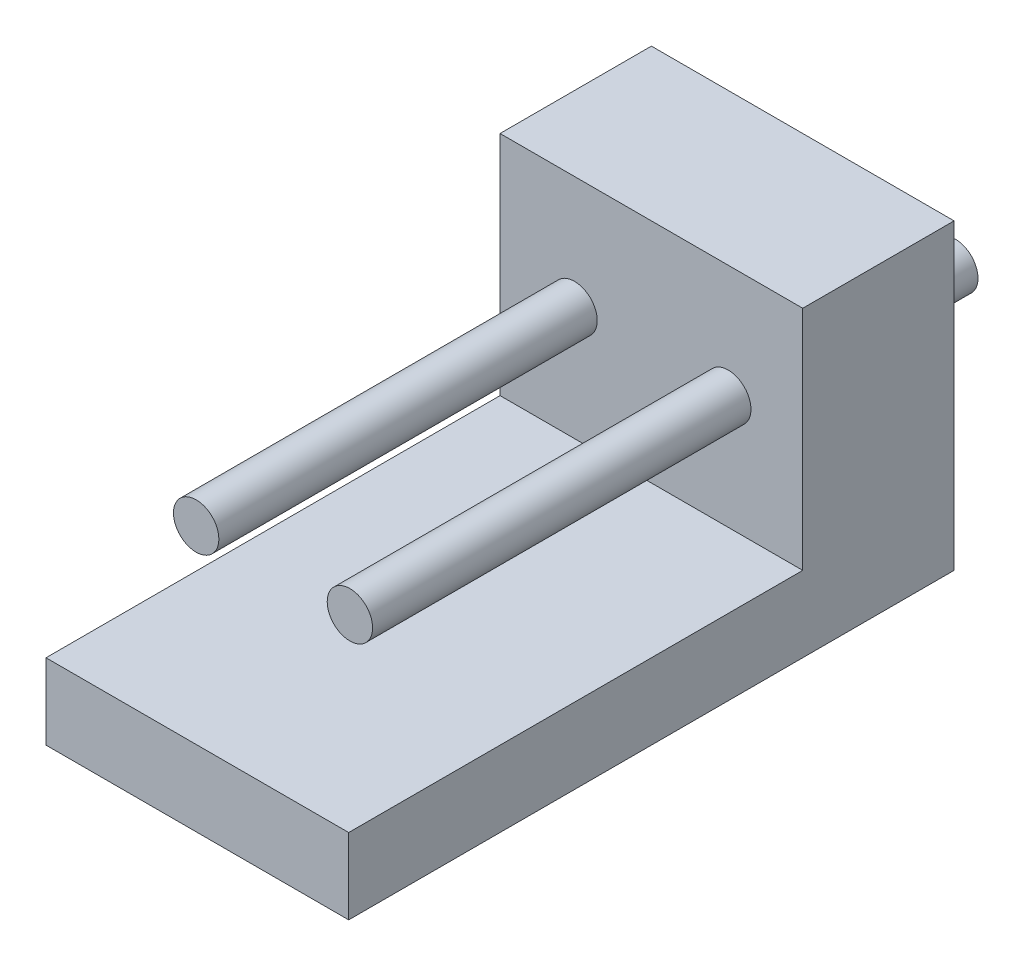
ISO-10303-21;
HEADER;
FILE_DESCRIPTION(('STEP AP214'),'2;1');
FILE_NAME('part.step','',(''),(''),'','','');
FILE_SCHEMA(('AUTOMOTIVE_DESIGN { 1 0 10303 214 1 1 1 1 }'));
ENDSEC;
DATA;
#1=APPLICATION_CONTEXT('core data for automotive mechanical design processes');
#2=APPLICATION_PROTOCOL_DEFINITION('international standard','automotive_design',2000,#1);
#3=PRODUCT_CONTEXT('',#1,'mechanical');
#4=PRODUCT('Part','Part','',(#3));
#5=PRODUCT_RELATED_PRODUCT_CATEGORY('part','',(#4));
#6=PRODUCT_DEFINITION_FORMATION('','',#4);
#7=PRODUCT_DEFINITION_CONTEXT('part definition',#1,'design');
#8=PRODUCT_DEFINITION('design','',#6,#7);
#9=PRODUCT_DEFINITION_SHAPE('','',#8);
#10=(LENGTH_UNIT() NAMED_UNIT(*) SI_UNIT(.MILLI.,.METRE.));
#11=(NAMED_UNIT(*) PLANE_ANGLE_UNIT() SI_UNIT($,.RADIAN.));
#12=(NAMED_UNIT(*) SI_UNIT($,.STERADIAN.) SOLID_ANGLE_UNIT());
#13=UNCERTAINTY_MEASURE_WITH_UNIT(LENGTH_MEASURE(1.E-05),#10,'distance_accuracy_value','');
#14=(GEOMETRIC_REPRESENTATION_CONTEXT(3) GLOBAL_UNCERTAINTY_ASSIGNED_CONTEXT((#13)) GLOBAL_UNIT_ASSIGNED_CONTEXT((#10,
#11,#12)) REPRESENTATION_CONTEXT('',''));
#15=CARTESIAN_POINT('',(0.,0.,0.));
#16=DIRECTION('',(0.,0.,1.));
#17=DIRECTION('',(1.,0.,0.));
#18=AXIS2_PLACEMENT_3D('',#15,#16,#17);
#19=CARTESIAN_POINT('',(0.,10.,5.));
#20=DIRECTION('',(0.,0.,-1.));
#21=DIRECTION('',(-1.,0.,0.));
#22=AXIS2_PLACEMENT_3D('',#19,#20,#21);
#23=PLANE('',#22);
#24=CARTESIAN_POINT('',(7.54,6.25,5.));
#25=DIRECTION('',(0.,0.,-1.));
#26=DIRECTION('',(-1.,0.,0.));
#27=AXIS2_PLACEMENT_3D('',#24,#25,#26);
#28=CIRCLE('',#27,0.750000000000001);
#29=CARTESIAN_POINT('',(6.79,6.25,5.));
#30=VERTEX_POINT('',#29);
#31=EDGE_CURVE('E38',#30,#30,#28,.F.);
#32=ORIENTED_EDGE('',*,*,#31,.F.);
#33=EDGE_LOOP('',(#32));
#34=FACE_BOUND('',#33,.T.);
#35=DIRECTION('',(-1.,0.,0.));
#36=VECTOR('',#35,1.);
#37=CARTESIAN_POINT('',(0.,2.5,5.));
#38=LINE('',#37,#36);
#39=CARTESIAN_POINT('',(10.,2.5,5.));
#40=VERTEX_POINT('',#39);
#41=CARTESIAN_POINT('',(0.,2.5,5.));
#42=VERTEX_POINT('',#41);
#43=EDGE_CURVE('E46',#40,#42,#38,.T.);
#44=ORIENTED_EDGE('',*,*,#43,.F.);
#45=DIRECTION('',(0.,1.,0.));
#46=VECTOR('',#45,1.);
#47=CARTESIAN_POINT('',(10.,0.,5.));
#48=LINE('',#47,#46);
#49=CARTESIAN_POINT('',(10.,10.,5.));
#50=VERTEX_POINT('',#49);
#51=EDGE_CURVE('E86',#40,#50,#48,.T.);
#52=ORIENTED_EDGE('',*,*,#51,.T.);
#53=DIRECTION('',(-1.,0.,0.));
#54=VECTOR('',#53,1.);
#55=CARTESIAN_POINT('',(0.,10.,5.));
#56=LINE('',#55,#54);
#57=CARTESIAN_POINT('',(0.,10.,5.));
#58=VERTEX_POINT('',#57);
#59=EDGE_CURVE('E51',#50,#58,#56,.T.);
#60=ORIENTED_EDGE('',*,*,#59,.T.);
#61=DIRECTION('',(0.,-1.,0.));
#62=VECTOR('',#61,1.);
#63=CARTESIAN_POINT('',(0.,0.,5.));
#64=LINE('',#63,#62);
#65=EDGE_CURVE('E81',#58,#42,#64,.T.);
#66=ORIENTED_EDGE('',*,*,#65,.T.);
#67=EDGE_LOOP('',(#44,#52,#60,#66));
#68=FACE_BOUND('',#67,.T.);
#69=CARTESIAN_POINT('',(2.46,6.25,5.));
#70=DIRECTION('',(0.,0.,-1.));
#71=DIRECTION('',(-1.,0.,0.));
#72=AXIS2_PLACEMENT_3D('',#69,#70,#71);
#73=CIRCLE('',#72,0.750000000000001);
#74=CARTESIAN_POINT('',(1.71,6.25,5.));
#75=VERTEX_POINT('',#74);
#76=EDGE_CURVE('E11',#75,#75,#73,.F.);
#77=ORIENTED_EDGE('',*,*,#76,.F.);
#78=EDGE_LOOP('',(#77));
#79=FACE_BOUND('',#78,.T.);
#80=ADVANCED_FACE('F29',(#34,#68,#79),#23,.F.);
#81=CARTESIAN_POINT('',(0.,10.,0.));
#82=DIRECTION('',(0.,0.,-1.));
#83=DIRECTION('',(-1.,0.,0.));
#84=AXIS2_PLACEMENT_3D('',#81,#82,#83);
#85=PLANE('',#84);
#86=CARTESIAN_POINT('',(7.54,6.25,0.));
#87=DIRECTION('',(0.,0.,-1.));
#88=DIRECTION('',(-1.,0.,0.));
#89=AXIS2_PLACEMENT_3D('',#86,#87,#88);
#90=CIRCLE('',#89,0.750000000000001);
#91=CARTESIAN_POINT('',(6.79,6.25,0.));
#92=VERTEX_POINT('',#91);
#93=EDGE_CURVE('E99',#92,#92,#90,.F.);
#94=ORIENTED_EDGE('',*,*,#93,.T.);
#95=EDGE_LOOP('',(#94));
#96=FACE_BOUND('',#95,.T.);
#97=DIRECTION('',(0.,-1.,0.));
#98=VECTOR('',#97,1.);
#99=CARTESIAN_POINT('',(0.,0.,0.));
#100=LINE('',#99,#98);
#101=CARTESIAN_POINT('',(0.,10.,0.));
#102=VERTEX_POINT('',#101);
#103=CARTESIAN_POINT('',(0.,0.,0.));
#104=VERTEX_POINT('',#103);
#105=EDGE_CURVE('E105',#102,#104,#100,.T.);
#106=ORIENTED_EDGE('',*,*,#105,.F.);
#107=DIRECTION('',(-1.,0.,0.));
#108=VECTOR('',#107,1.);
#109=CARTESIAN_POINT('',(0.,10.,0.));
#110=LINE('',#109,#108);
#111=CARTESIAN_POINT('',(10.,10.,0.));
#112=VERTEX_POINT('',#111);
#113=EDGE_CURVE('E87',#112,#102,#110,.T.);
#114=ORIENTED_EDGE('',*,*,#113,.F.);
#115=DIRECTION('',(0.,1.,0.));
#116=VECTOR('',#115,1.);
#117=CARTESIAN_POINT('',(10.,0.,0.));
#118=LINE('',#117,#116);
#119=CARTESIAN_POINT('',(10.,0.,0.));
#120=VERTEX_POINT('',#119);
#121=EDGE_CURVE('E139',#120,#112,#118,.T.);
#122=ORIENTED_EDGE('',*,*,#121,.F.);
#123=DIRECTION('',(1.,0.,0.));
#124=VECTOR('',#123,1.);
#125=CARTESIAN_POINT('',(0.,0.,0.));
#126=LINE('',#125,#124);
#127=EDGE_CURVE('E137',#104,#120,#126,.T.);
#128=ORIENTED_EDGE('',*,*,#127,.F.);
#129=EDGE_LOOP('',(#106,#114,#122,#128));
#130=FACE_BOUND('',#129,.T.);
#131=CARTESIAN_POINT('',(2.46,6.25,0.));
#132=DIRECTION('',(0.,0.,-1.));
#133=DIRECTION('',(-1.,0.,0.));
#134=AXIS2_PLACEMENT_3D('',#131,#132,#133);
#135=CIRCLE('',#134,0.750000000000001);
#136=CARTESIAN_POINT('',(1.71,6.25,0.));
#137=VERTEX_POINT('',#136);
#138=EDGE_CURVE('E33',#137,#137,#135,.F.);
#139=ORIENTED_EDGE('',*,*,#138,.T.);
#140=EDGE_LOOP('',(#139));
#141=FACE_BOUND('',#140,.T.);
#142=ADVANCED_FACE('F166',(#96,#130,#141),#85,.T.);
#143=CARTESIAN_POINT('',(0.,0.,5.));
#144=DIRECTION('',(1.,0.,0.));
#145=DIRECTION('',(0.,0.,-1.));
#146=AXIS2_PLACEMENT_3D('',#143,#144,#145);
#147=PLANE('',#146);
#148=ORIENTED_EDGE('',*,*,#105,.T.);
#149=DIRECTION('',(0.,0.,-1.));
#150=VECTOR('',#149,1.);
#151=CARTESIAN_POINT('',(0.,0.,5.));
#152=LINE('',#151,#150);
#153=CARTESIAN_POINT('',(0.,0.,20.));
#154=VERTEX_POINT('',#153);
#155=EDGE_CURVE('E128',#154,#104,#152,.T.);
#156=ORIENTED_EDGE('',*,*,#155,.F.);
#157=DIRECTION('',(0.,-1.,0.));
#158=VECTOR('',#157,1.);
#159=CARTESIAN_POINT('',(0.,0.,20.));
#160=LINE('',#159,#158);
#161=CARTESIAN_POINT('',(0.,2.5,20.));
#162=VERTEX_POINT('',#161);
#163=EDGE_CURVE('E98',#162,#154,#160,.T.);
#164=ORIENTED_EDGE('',*,*,#163,.F.);
#165=DIRECTION('',(0.,0.,-1.));
#166=VECTOR('',#165,1.);
#167=CARTESIAN_POINT('',(0.,2.5,20.));
#168=LINE('',#167,#166);
#169=EDGE_CURVE('E94',#162,#42,#168,.T.);
#170=ORIENTED_EDGE('',*,*,#169,.T.);
#171=ORIENTED_EDGE('',*,*,#65,.F.);
#172=DIRECTION('',(0.,0.,-1.));
#173=VECTOR('',#172,1.);
#174=CARTESIAN_POINT('',(0.,10.,5.));
#175=LINE('',#174,#173);
#176=EDGE_CURVE('E149',#58,#102,#175,.T.);
#177=ORIENTED_EDGE('',*,*,#176,.T.);
#178=EDGE_LOOP('',(#148,#156,#164,#170,#171,#177));
#179=FACE_BOUND('',#178,.T.);
#180=ADVANCED_FACE('F31',(#179),#147,.F.);
#181=CARTESIAN_POINT('',(0.,0.,5.));
#182=DIRECTION('',(0.,1.,0.));
#183=DIRECTION('',(0.,0.,1.));
#184=AXIS2_PLACEMENT_3D('',#181,#182,#183);
#185=PLANE('',#184);
#186=ORIENTED_EDGE('',*,*,#127,.T.);
#187=DIRECTION('',(0.,0.,-1.));
#188=VECTOR('',#187,1.);
#189=CARTESIAN_POINT('',(10.,0.,5.));
#190=LINE('',#189,#188);
#191=CARTESIAN_POINT('',(10.,0.,20.));
#192=VERTEX_POINT('',#191);
#193=EDGE_CURVE('E154',#192,#120,#190,.T.);
#194=ORIENTED_EDGE('',*,*,#193,.F.);
#195=DIRECTION('',(1.,0.,0.));
#196=VECTOR('',#195,1.);
#197=CARTESIAN_POINT('',(0.,0.,20.));
#198=LINE('',#197,#196);
#199=EDGE_CURVE('E132',#154,#192,#198,.T.);
#200=ORIENTED_EDGE('',*,*,#199,.F.);
#201=ORIENTED_EDGE('',*,*,#155,.T.);
#202=EDGE_LOOP('',(#186,#194,#200,#201));
#203=FACE_BOUND('',#202,.T.);
#204=ADVANCED_FACE('F162',(#203),#185,.F.);
#205=CARTESIAN_POINT('',(10.,0.,5.));
#206=DIRECTION('',(-1.,0.,0.));
#207=DIRECTION('',(0.,0.,1.));
#208=AXIS2_PLACEMENT_3D('',#205,#206,#207);
#209=PLANE('',#208);
#210=ORIENTED_EDGE('',*,*,#121,.T.);
#211=DIRECTION('',(0.,0.,-1.));
#212=VECTOR('',#211,1.);
#213=CARTESIAN_POINT('',(10.,10.,5.));
#214=LINE('',#213,#212);
#215=EDGE_CURVE('E150',#50,#112,#214,.T.);
#216=ORIENTED_EDGE('',*,*,#215,.F.);
#217=ORIENTED_EDGE('',*,*,#51,.F.);
#218=DIRECTION('',(0.,0.,-1.));
#219=VECTOR('',#218,1.);
#220=CARTESIAN_POINT('',(10.,2.5,20.));
#221=LINE('',#220,#219);
#222=CARTESIAN_POINT('',(10.,2.5,20.));
#223=VERTEX_POINT('',#222);
#224=EDGE_CURVE('E97',#223,#40,#221,.T.);
#225=ORIENTED_EDGE('',*,*,#224,.F.);
#226=DIRECTION('',(0.,1.,0.));
#227=VECTOR('',#226,1.);
#228=CARTESIAN_POINT('',(10.,0.,20.));
#229=LINE('',#228,#227);
#230=EDGE_CURVE('E107',#192,#223,#229,.T.);
#231=ORIENTED_EDGE('',*,*,#230,.F.);
#232=ORIENTED_EDGE('',*,*,#193,.T.);
#233=EDGE_LOOP('',(#210,#216,#217,#225,#231,#232));
#234=FACE_BOUND('',#233,.T.);
#235=ADVANCED_FACE('F168',(#234),#209,.F.);
#236=CARTESIAN_POINT('',(0.,10.,5.));
#237=DIRECTION('',(0.,-1.,0.));
#238=DIRECTION('',(0.,0.,-1.));
#239=AXIS2_PLACEMENT_3D('',#236,#237,#238);
#240=PLANE('',#239);
#241=ORIENTED_EDGE('',*,*,#113,.T.);
#242=ORIENTED_EDGE('',*,*,#176,.F.);
#243=ORIENTED_EDGE('',*,*,#59,.F.);
#244=ORIENTED_EDGE('',*,*,#215,.T.);
#245=EDGE_LOOP('',(#241,#242,#243,#244));
#246=FACE_BOUND('',#245,.T.);
#247=ADVANCED_FACE('F170',(#246),#240,.F.);
#248=CARTESIAN_POINT('',(0.,2.5,20.));
#249=DIRECTION('',(0.,-1.,0.));
#250=DIRECTION('',(0.,0.,-1.));
#251=AXIS2_PLACEMENT_3D('',#248,#249,#250);
#252=PLANE('',#251);
#253=ORIENTED_EDGE('',*,*,#43,.T.);
#254=ORIENTED_EDGE('',*,*,#169,.F.);
#255=DIRECTION('',(-1.,0.,0.));
#256=VECTOR('',#255,1.);
#257=CARTESIAN_POINT('',(0.,2.5,20.));
#258=LINE('',#257,#256);
#259=EDGE_CURVE('E103',#223,#162,#258,.T.);
#260=ORIENTED_EDGE('',*,*,#259,.F.);
#261=ORIENTED_EDGE('',*,*,#224,.T.);
#262=EDGE_LOOP('',(#253,#254,#260,#261));
#263=FACE_BOUND('',#262,.T.);
#264=ADVANCED_FACE('F92',(#263),#252,.F.);
#265=CARTESIAN_POINT('',(0.,2.5,20.));
#266=DIRECTION('',(0.,0.,-1.));
#267=DIRECTION('',(-1.,0.,0.));
#268=AXIS2_PLACEMENT_3D('',#265,#266,#267);
#269=PLANE('',#268);
#270=ORIENTED_EDGE('',*,*,#163,.T.);
#271=ORIENTED_EDGE('',*,*,#199,.T.);
#272=ORIENTED_EDGE('',*,*,#230,.T.);
#273=ORIENTED_EDGE('',*,*,#259,.T.);
#274=EDGE_LOOP('',(#270,#271,#272,#273));
#275=FACE_BOUND('',#274,.T.);
#276=ADVANCED_FACE('F177',(#275),#269,.F.);
#277=CARTESIAN_POINT('',(7.54,6.25,-2.5));
#278=DIRECTION('',(0.,0.,1.));
#279=DIRECTION('',(1.,0.,0.));
#280=AXIS2_PLACEMENT_3D('',#277,#278,#279);
#281=PLANE('',#280);
#282=CARTESIAN_POINT('',(7.54,6.25,-2.5));
#283=DIRECTION('',(0.,0.,1.));
#284=DIRECTION('',(1.,0.,0.));
#285=AXIS2_PLACEMENT_3D('',#282,#283,#284);
#286=CIRCLE('',#285,0.750000000000001);
#287=CARTESIAN_POINT('',(8.29,6.25,-2.5));
#288=VERTEX_POINT('',#287);
#289=EDGE_CURVE('E120',#288,#288,#286,.T.);
#290=ORIENTED_EDGE('',*,*,#289,.F.);
#291=EDGE_LOOP('',(#290));
#292=FACE_BOUND('',#291,.T.);
#293=ADVANCED_FACE('F191',(#292),#281,.F.);
#294=CARTESIAN_POINT('',(7.54,6.25,17.5));
#295=DIRECTION('',(0.,0.,-1.));
#296=DIRECTION('',(-1.,0.,0.));
#297=AXIS2_PLACEMENT_3D('',#294,#295,#296);
#298=CYLINDRICAL_SURFACE('',#297,0.750000000000001);
#299=ORIENTED_EDGE('',*,*,#93,.F.);
#300=EDGE_LOOP('',(#299));
#301=FACE_BOUND('',#300,.T.);
#302=ORIENTED_EDGE('',*,*,#289,.T.);
#303=EDGE_LOOP('',(#302));
#304=FACE_BOUND('',#303,.T.);
#305=ADVANCED_FACE('F193',(#301,#304),#298,.T.);
#306=CARTESIAN_POINT('',(7.54,6.25,17.5));
#307=DIRECTION('',(0.,0.,1.));
#308=DIRECTION('',(1.,0.,0.));
#309=AXIS2_PLACEMENT_3D('',#306,#307,#308);
#310=CIRCLE('',#309,0.750000000000001);
#311=CARTESIAN_POINT('',(8.29,6.25,17.5));
#312=VERTEX_POINT('',#311);
#313=EDGE_CURVE('E116',#312,#312,#310,.T.);
#314=ORIENTED_EDGE('',*,*,#313,.F.);
#315=EDGE_LOOP('',(#314));
#316=FACE_BOUND('',#315,.T.);
#317=ORIENTED_EDGE('',*,*,#31,.T.);
#318=EDGE_LOOP('',(#317));
#319=FACE_BOUND('',#318,.T.);
#320=ADVANCED_FACE('F196',(#316,#319),#298,.T.);
#321=CARTESIAN_POINT('',(7.54,6.25,17.5));
#322=DIRECTION('',(0.,0.,1.));
#323=DIRECTION('',(1.,0.,0.));
#324=AXIS2_PLACEMENT_3D('',#321,#322,#323);
#325=PLANE('',#324);
#326=ORIENTED_EDGE('',*,*,#313,.T.);
#327=EDGE_LOOP('',(#326));
#328=FACE_BOUND('',#327,.T.);
#329=ADVANCED_FACE('F198',(#328),#325,.T.);
#330=CARTESIAN_POINT('',(2.46,6.25,-2.5));
#331=DIRECTION('',(0.,0.,1.));
#332=DIRECTION('',(1.,0.,0.));
#333=AXIS2_PLACEMENT_3D('',#330,#331,#332);
#334=PLANE('',#333);
#335=CARTESIAN_POINT('',(2.46,6.25,-2.5));
#336=DIRECTION('',(0.,0.,1.));
#337=DIRECTION('',(1.,0.,0.));
#338=AXIS2_PLACEMENT_3D('',#335,#336,#337);
#339=CIRCLE('',#338,0.750000000000001);
#340=CARTESIAN_POINT('',(3.21,6.25,-2.5));
#341=VERTEX_POINT('',#340);
#342=EDGE_CURVE('E220',#341,#341,#339,.T.);
#343=ORIENTED_EDGE('',*,*,#342,.F.);
#344=EDGE_LOOP('',(#343));
#345=FACE_BOUND('',#344,.T.);
#346=ADVANCED_FACE('F201',(#345),#334,.F.);
#347=CARTESIAN_POINT('',(2.46,6.25,17.5));
#348=DIRECTION('',(0.,0.,-1.));
#349=DIRECTION('',(-1.,0.,0.));
#350=AXIS2_PLACEMENT_3D('',#347,#348,#349);
#351=CYLINDRICAL_SURFACE('',#350,0.750000000000001);
#352=ORIENTED_EDGE('',*,*,#138,.F.);
#353=EDGE_LOOP('',(#352));
#354=FACE_BOUND('',#353,.T.);
#355=ORIENTED_EDGE('',*,*,#342,.T.);
#356=EDGE_LOOP('',(#355));
#357=FACE_BOUND('',#356,.T.);
#358=ADVANCED_FACE('F205',(#354,#357),#351,.T.);
#359=CARTESIAN_POINT('',(2.46,6.25,17.5));
#360=DIRECTION('',(0.,0.,1.));
#361=DIRECTION('',(1.,0.,0.));
#362=AXIS2_PLACEMENT_3D('',#359,#360,#361);
#363=CIRCLE('',#362,0.750000000000001);
#364=CARTESIAN_POINT('',(3.21,6.25,17.5));
#365=VERTEX_POINT('',#364);
#366=EDGE_CURVE('E222',#365,#365,#363,.T.);
#367=ORIENTED_EDGE('',*,*,#366,.F.);
#368=EDGE_LOOP('',(#367));
#369=FACE_BOUND('',#368,.T.);
#370=ORIENTED_EDGE('',*,*,#76,.T.);
#371=EDGE_LOOP('',(#370));
#372=FACE_BOUND('',#371,.T.);
#373=ADVANCED_FACE('F208',(#369,#372),#351,.T.);
#374=CARTESIAN_POINT('',(2.46,6.25,17.5));
#375=DIRECTION('',(0.,0.,1.));
#376=DIRECTION('',(1.,0.,0.));
#377=AXIS2_PLACEMENT_3D('',#374,#375,#376);
#378=PLANE('',#377);
#379=ORIENTED_EDGE('',*,*,#366,.T.);
#380=EDGE_LOOP('',(#379));
#381=FACE_BOUND('',#380,.T.);
#382=ADVANCED_FACE('F210',(#381),#378,.T.);
#383=CLOSED_SHELL('',(#80,#142,#180,#204,#235,#247,#264,#276,#293,#305,#320,#329,#346,#358,#373,#382));
#384=MANIFOLD_SOLID_BREP('B2',#383);
#385=ADVANCED_BREP_SHAPE_REPRESENTATION('',(#18,#384),#14);
#386=SHAPE_DEFINITION_REPRESENTATION(#9,#385);
ENDSEC;
END-ISO-10303-21;
